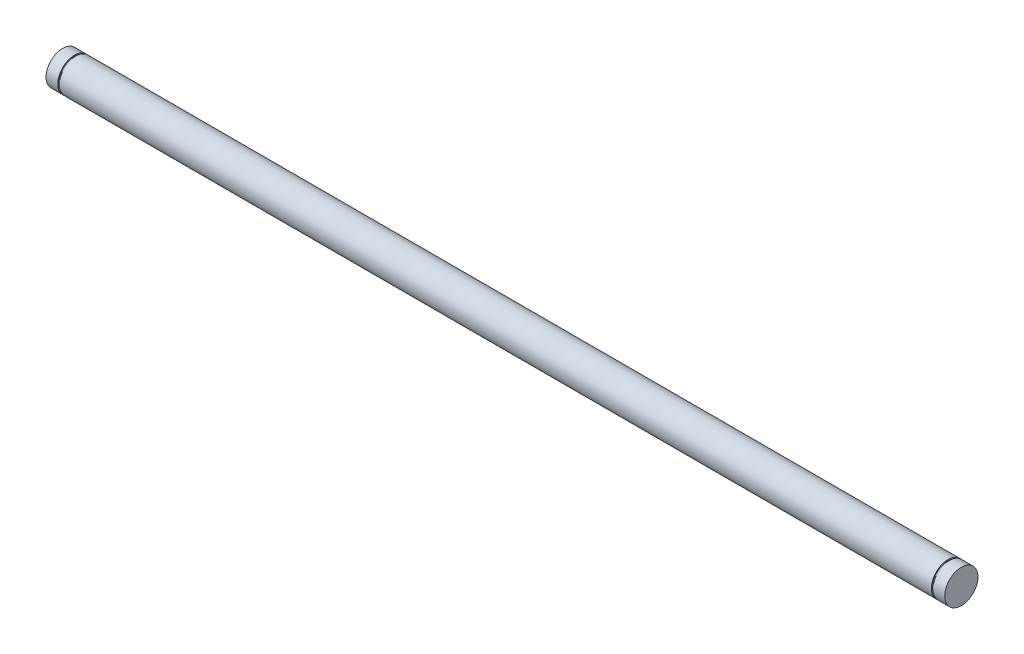
ISO-10303-21;
HEADER;
FILE_DESCRIPTION(('STEP AP214'),'2;1');
FILE_NAME('part.step','',(''),(''),'','','');
FILE_SCHEMA(('AUTOMOTIVE_DESIGN { 1 0 10303 214 1 1 1 1 }'));
ENDSEC;
DATA;
#1=APPLICATION_CONTEXT('core data for automotive mechanical design processes');
#2=APPLICATION_PROTOCOL_DEFINITION('international standard','automotive_design',2000,#1);
#3=PRODUCT_CONTEXT('',#1,'mechanical');
#4=PRODUCT('Part','Part','',(#3));
#5=PRODUCT_RELATED_PRODUCT_CATEGORY('part','',(#4));
#6=PRODUCT_DEFINITION_FORMATION('','',#4);
#7=PRODUCT_DEFINITION_CONTEXT('part definition',#1,'design');
#8=PRODUCT_DEFINITION('design','',#6,#7);
#9=PRODUCT_DEFINITION_SHAPE('','',#8);
#10=(LENGTH_UNIT() NAMED_UNIT(*) SI_UNIT(.MILLI.,.METRE.));
#11=(NAMED_UNIT(*) PLANE_ANGLE_UNIT() SI_UNIT($,.RADIAN.));
#12=(NAMED_UNIT(*) SI_UNIT($,.STERADIAN.) SOLID_ANGLE_UNIT());
#13=UNCERTAINTY_MEASURE_WITH_UNIT(LENGTH_MEASURE(1.E-05),#10,'distance_accuracy_value','');
#14=(GEOMETRIC_REPRESENTATION_CONTEXT(3) GLOBAL_UNCERTAINTY_ASSIGNED_CONTEXT((#13)) GLOBAL_UNIT_ASSIGNED_CONTEXT((#10,
#11,#12)) REPRESENTATION_CONTEXT('',''));
#15=CARTESIAN_POINT('',(0.,0.,0.));
#16=DIRECTION('',(0.,0.,1.));
#17=DIRECTION('',(1.,0.,0.));
#18=AXIS2_PLACEMENT_3D('',#15,#16,#17);
#19=CARTESIAN_POINT('',(685.8,0.,0.));
#20=DIRECTION('',(-1.,0.,0.));
#21=DIRECTION('',(0.,0.,1.));
#22=AXIS2_PLACEMENT_3D('',#19,#20,#21);
#23=CYLINDRICAL_SURFACE('',#22,12.7);
#24=CARTESIAN_POINT('',(10.16,0.,0.));
#25=DIRECTION('',(-1.,0.,0.));
#26=DIRECTION('',(0.,0.,1.));
#27=AXIS2_PLACEMENT_3D('',#24,#25,#26);
#28=CIRCLE('',#27,12.7);
#29=CARTESIAN_POINT('',(10.16,0.,12.7));
#30=VERTEX_POINT('',#29);
#31=EDGE_CURVE('E48',#30,#30,#28,.T.);
#32=ORIENTED_EDGE('',*,*,#31,.F.);
#33=EDGE_LOOP('',(#32));
#34=FACE_BOUND('',#33,.T.);
#35=CARTESIAN_POINT('',(675.64,0.,0.));
#36=DIRECTION('',(-1.,0.,0.));
#37=DIRECTION('',(0.,0.,1.));
#38=AXIS2_PLACEMENT_3D('',#35,#36,#37);
#39=CIRCLE('',#38,12.7);
#40=CARTESIAN_POINT('',(675.64,0.,12.7));
#41=VERTEX_POINT('',#40);
#42=EDGE_CURVE('E60',#41,#41,#39,.T.);
#43=ORIENTED_EDGE('',*,*,#42,.T.);
#44=EDGE_LOOP('',(#43));
#45=FACE_BOUND('',#44,.T.);
#46=ADVANCED_FACE('F35',(#34,#45),#23,.T.);
#47=CARTESIAN_POINT('',(8.9916,0.,0.));
#48=DIRECTION('',(-1.,0.,0.));
#49=DIRECTION('',(0.,0.,1.));
#50=AXIS2_PLACEMENT_3D('',#47,#48,#49);
#51=CIRCLE('',#50,12.7);
#52=CARTESIAN_POINT('',(8.9916,0.,12.7));
#53=VERTEX_POINT('',#52);
#54=EDGE_CURVE('E46',#53,#53,#51,.T.);
#55=ORIENTED_EDGE('',*,*,#54,.T.);
#56=EDGE_LOOP('',(#55));
#57=FACE_BOUND('',#56,.T.);
#58=CARTESIAN_POINT('',(0.,0.,0.));
#59=DIRECTION('',(1.,0.,0.));
#60=DIRECTION('',(0.,0.,-1.));
#61=AXIS2_PLACEMENT_3D('',#58,#59,#60);
#62=CIRCLE('',#61,12.7);
#63=CARTESIAN_POINT('',(0.,0.,-12.7));
#64=VERTEX_POINT('',#63);
#65=EDGE_CURVE('E39',#64,#64,#62,.T.);
#66=ORIENTED_EDGE('',*,*,#65,.T.);
#67=EDGE_LOOP('',(#66));
#68=FACE_BOUND('',#67,.T.);
#69=ADVANCED_FACE('F37',(#57,#68),#23,.T.);
#70=CARTESIAN_POINT('',(0.,0.,0.));
#71=DIRECTION('',(1.,0.,0.));
#72=DIRECTION('',(0.,0.,-1.));
#73=AXIS2_PLACEMENT_3D('',#70,#71,#72);
#74=PLANE('',#73);
#75=ORIENTED_EDGE('',*,*,#65,.F.);
#76=EDGE_LOOP('',(#75));
#77=FACE_BOUND('',#76,.T.);
#78=ADVANCED_FACE('F92',(#77),#74,.F.);
#79=CARTESIAN_POINT('',(8.9916,0.,0.));
#80=DIRECTION('',(-1.,0.,0.));
#81=DIRECTION('',(0.,0.,1.));
#82=AXIS2_PLACEMENT_3D('',#79,#80,#81);
#83=PLANE('',#82);
#84=ORIENTED_EDGE('',*,*,#54,.F.);
#85=EDGE_LOOP('',(#84));
#86=FACE_BOUND('',#85,.T.);
#87=CARTESIAN_POINT('',(8.9916,0.,0.));
#88=DIRECTION('',(-1.,0.,0.));
#89=DIRECTION('',(0.,0.,1.));
#90=AXIS2_PLACEMENT_3D('',#87,#88,#89);
#91=CIRCLE('',#90,11.938);
#92=CARTESIAN_POINT('',(8.9916,0.,11.938));
#93=VERTEX_POINT('',#92);
#94=EDGE_CURVE('E51',#93,#93,#91,.T.);
#95=ORIENTED_EDGE('',*,*,#94,.T.);
#96=EDGE_LOOP('',(#95));
#97=FACE_BOUND('',#96,.T.);
#98=ADVANCED_FACE('F114',(#86,#97),#83,.F.);
#99=CARTESIAN_POINT('',(10.16,0.,0.));
#100=DIRECTION('',(-1.,0.,0.));
#101=DIRECTION('',(0.,0.,1.));
#102=AXIS2_PLACEMENT_3D('',#99,#100,#101);
#103=PLANE('',#102);
#104=ORIENTED_EDGE('',*,*,#31,.T.);
#105=EDGE_LOOP('',(#104));
#106=FACE_BOUND('',#105,.T.);
#107=CARTESIAN_POINT('',(10.16,0.,0.));
#108=DIRECTION('',(-1.,0.,0.));
#109=DIRECTION('',(0.,0.,1.));
#110=AXIS2_PLACEMENT_3D('',#107,#108,#109);
#111=CIRCLE('',#110,11.938);
#112=CARTESIAN_POINT('',(10.16,0.,11.938));
#113=VERTEX_POINT('',#112);
#114=EDGE_CURVE('E54',#113,#113,#111,.T.);
#115=ORIENTED_EDGE('',*,*,#114,.F.);
#116=EDGE_LOOP('',(#115));
#117=FACE_BOUND('',#116,.T.);
#118=ADVANCED_FACE('F112',(#106,#117),#103,.T.);
#119=CARTESIAN_POINT('',(8.9916,0.,0.));
#120=DIRECTION('',(1.,0.,0.));
#121=DIRECTION('',(0.,0.,-1.));
#122=AXIS2_PLACEMENT_3D('',#119,#120,#121);
#123=CYLINDRICAL_SURFACE('',#122,11.938);
#124=ORIENTED_EDGE('',*,*,#94,.F.);
#125=EDGE_LOOP('',(#124));
#126=FACE_BOUND('',#125,.T.);
#127=ORIENTED_EDGE('',*,*,#114,.T.);
#128=EDGE_LOOP('',(#127));
#129=FACE_BOUND('',#128,.T.);
#130=ADVANCED_FACE('F79',(#126,#129),#123,.T.);
#131=CARTESIAN_POINT('',(676.8084,0.,0.));
#132=DIRECTION('',(1.,0.,0.));
#133=DIRECTION('',(0.,0.,1.));
#134=AXIS2_PLACEMENT_3D('',#131,#132,#133);
#135=PLANE('',#134);
#136=CARTESIAN_POINT('',(676.8084,0.,0.));
#137=DIRECTION('',(-1.,0.,0.));
#138=DIRECTION('',(0.,0.,1.));
#139=AXIS2_PLACEMENT_3D('',#136,#137,#138);
#140=CIRCLE('',#139,11.938);
#141=CARTESIAN_POINT('',(676.8084,0.,11.938));
#142=VERTEX_POINT('',#141);
#143=EDGE_CURVE('E63',#142,#142,#140,.T.);
#144=ORIENTED_EDGE('',*,*,#143,.F.);
#145=EDGE_LOOP('',(#144));
#146=FACE_BOUND('',#145,.T.);
#147=CARTESIAN_POINT('',(676.8084,0.,0.));
#148=DIRECTION('',(-1.,0.,0.));
#149=DIRECTION('',(0.,0.,1.));
#150=AXIS2_PLACEMENT_3D('',#147,#148,#149);
#151=CIRCLE('',#150,12.7);
#152=CARTESIAN_POINT('',(676.8084,0.,12.7));
#153=VERTEX_POINT('',#152);
#154=EDGE_CURVE('E57',#153,#153,#151,.T.);
#155=ORIENTED_EDGE('',*,*,#154,.T.);
#156=EDGE_LOOP('',(#155));
#157=FACE_BOUND('',#156,.T.);
#158=ADVANCED_FACE('F75',(#146,#157),#135,.F.);
#159=CARTESIAN_POINT('',(675.64,0.,0.));
#160=DIRECTION('',(1.,0.,0.));
#161=DIRECTION('',(0.,0.,1.));
#162=AXIS2_PLACEMENT_3D('',#159,#160,#161);
#163=PLANE('',#162);
#164=CARTESIAN_POINT('',(675.64,0.,0.));
#165=DIRECTION('',(-1.,0.,0.));
#166=DIRECTION('',(0.,0.,1.));
#167=AXIS2_PLACEMENT_3D('',#164,#165,#166);
#168=CIRCLE('',#167,11.938);
#169=CARTESIAN_POINT('',(675.64,0.,11.938));
#170=VERTEX_POINT('',#169);
#171=EDGE_CURVE('E66',#170,#170,#168,.T.);
#172=ORIENTED_EDGE('',*,*,#171,.T.);
#173=EDGE_LOOP('',(#172));
#174=FACE_BOUND('',#173,.T.);
#175=ORIENTED_EDGE('',*,*,#42,.F.);
#176=EDGE_LOOP('',(#175));
#177=FACE_BOUND('',#176,.T.);
#178=ADVANCED_FACE('F78',(#174,#177),#163,.T.);
#179=CARTESIAN_POINT('',(676.8084,0.,0.));
#180=DIRECTION('',(-1.,0.,0.));
#181=DIRECTION('',(0.,0.,1.));
#182=AXIS2_PLACEMENT_3D('',#179,#180,#181);
#183=CYLINDRICAL_SURFACE('',#182,11.938);
#184=ORIENTED_EDGE('',*,*,#143,.T.);
#185=EDGE_LOOP('',(#184));
#186=FACE_BOUND('',#185,.T.);
#187=ORIENTED_EDGE('',*,*,#171,.F.);
#188=EDGE_LOOP('',(#187));
#189=FACE_BOUND('',#188,.T.);
#190=ADVANCED_FACE('F72',(#186,#189),#183,.T.);
#191=CARTESIAN_POINT('',(685.8,0.,0.));
#192=DIRECTION('',(1.,0.,0.));
#193=DIRECTION('',(0.,0.,-1.));
#194=AXIS2_PLACEMENT_3D('',#191,#192,#193);
#195=PLANE('',#194);
#196=CARTESIAN_POINT('',(685.8,0.,0.));
#197=DIRECTION('',(1.,0.,0.));
#198=DIRECTION('',(0.,0.,-1.));
#199=AXIS2_PLACEMENT_3D('',#196,#197,#198);
#200=CIRCLE('',#199,12.7);
#201=CARTESIAN_POINT('',(685.8,0.,-12.7));
#202=VERTEX_POINT('',#201);
#203=EDGE_CURVE('E10',#202,#202,#200,.T.);
#204=ORIENTED_EDGE('',*,*,#203,.T.);
#205=EDGE_LOOP('',(#204));
#206=FACE_BOUND('',#205,.T.);
#207=ADVANCED_FACE('F86',(#206),#195,.T.);
#208=ORIENTED_EDGE('',*,*,#154,.F.);
#209=EDGE_LOOP('',(#208));
#210=FACE_BOUND('',#209,.T.);
#211=ORIENTED_EDGE('',*,*,#203,.F.);
#212=EDGE_LOOP('',(#211));
#213=FACE_BOUND('',#212,.T.);
#214=ADVANCED_FACE('F83',(#210,#213),#23,.T.);
#215=CLOSED_SHELL('',(#46,#69,#78,#98,#118,#130,#158,#178,#190,#207,#214));
#216=MANIFOLD_SOLID_BREP('B2',#215);
#217=ADVANCED_BREP_SHAPE_REPRESENTATION('',(#18,#216),#14);
#218=SHAPE_DEFINITION_REPRESENTATION(#9,#217);
ENDSEC;
END-ISO-10303-21;
